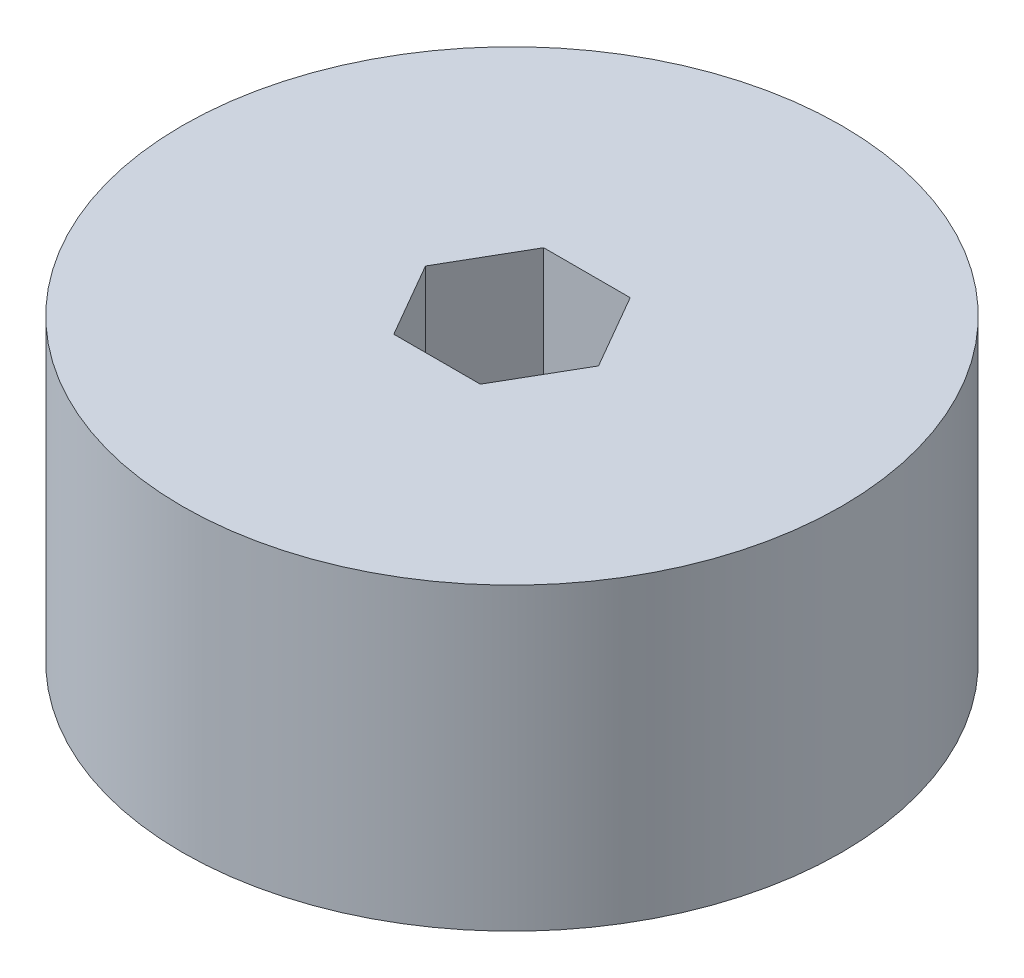
ISO-10303-21;
HEADER;
FILE_DESCRIPTION(('STEP AP214'),'2;1');
FILE_NAME('part.step','',(''),(''),'','','');
FILE_SCHEMA(('AUTOMOTIVE_DESIGN { 1 0 10303 214 1 1 1 1 }'));
ENDSEC;
DATA;
#1=APPLICATION_CONTEXT('core data for automotive mechanical design processes');
#2=APPLICATION_PROTOCOL_DEFINITION('international standard','automotive_design',2000,#1);
#3=PRODUCT_CONTEXT('',#1,'mechanical');
#4=PRODUCT('Part','Part','',(#3));
#5=PRODUCT_RELATED_PRODUCT_CATEGORY('part','',(#4));
#6=PRODUCT_DEFINITION_FORMATION('','',#4);
#7=PRODUCT_DEFINITION_CONTEXT('part definition',#1,'design');
#8=PRODUCT_DEFINITION('design','',#6,#7);
#9=PRODUCT_DEFINITION_SHAPE('','',#8);
#10=(LENGTH_UNIT() NAMED_UNIT(*) SI_UNIT(.MILLI.,.METRE.));
#11=(NAMED_UNIT(*) PLANE_ANGLE_UNIT() SI_UNIT($,.RADIAN.));
#12=(NAMED_UNIT(*) SI_UNIT($,.STERADIAN.) SOLID_ANGLE_UNIT());
#13=UNCERTAINTY_MEASURE_WITH_UNIT(LENGTH_MEASURE(1.E-05),#10,'distance_accuracy_value','');
#14=(GEOMETRIC_REPRESENTATION_CONTEXT(3) GLOBAL_UNCERTAINTY_ASSIGNED_CONTEXT((#13)) GLOBAL_UNIT_ASSIGNED_CONTEXT((#10,
#11,#12)) REPRESENTATION_CONTEXT('',''));
#15=CARTESIAN_POINT('',(0.,0.,0.));
#16=DIRECTION('',(0.,0.,1.));
#17=DIRECTION('',(1.,0.,0.));
#18=AXIS2_PLACEMENT_3D('',#15,#16,#17);
#19=CARTESIAN_POINT('',(0.,25.4,0.));
#20=DIRECTION('',(0.,-1.,0.));
#21=DIRECTION('',(0.,0.,-1.));
#22=AXIS2_PLACEMENT_3D('',#19,#20,#21);
#23=CYLINDRICAL_SURFACE('',#22,27.94);
#24=CARTESIAN_POINT('',(0.,25.4,0.));
#25=DIRECTION('',(0.,1.,0.));
#26=DIRECTION('',(0.,0.,1.));
#27=AXIS2_PLACEMENT_3D('',#24,#25,#26);
#28=CIRCLE('',#27,27.94);
#29=CARTESIAN_POINT('',(0.,25.4,27.94));
#30=VERTEX_POINT('',#29);
#31=EDGE_CURVE('E11',#30,#30,#28,.T.);
#32=ORIENTED_EDGE('',*,*,#31,.F.);
#33=EDGE_LOOP('',(#32));
#34=FACE_BOUND('',#33,.T.);
#35=CARTESIAN_POINT('',(0.,0.,0.));
#36=DIRECTION('',(0.,1.,0.));
#37=DIRECTION('',(0.,0.,1.));
#38=AXIS2_PLACEMENT_3D('',#35,#36,#37);
#39=CIRCLE('',#38,27.94);
#40=CARTESIAN_POINT('',(0.,0.,27.94));
#41=VERTEX_POINT('',#40);
#42=EDGE_CURVE('E46',#41,#41,#39,.T.);
#43=ORIENTED_EDGE('',*,*,#42,.T.);
#44=EDGE_LOOP('',(#43));
#45=FACE_BOUND('',#44,.T.);
#46=ADVANCED_FACE('F43',(#34,#45),#23,.T.);
#47=CARTESIAN_POINT('',(0.,25.4,0.));
#48=DIRECTION('',(0.,1.,0.));
#49=DIRECTION('',(0.,0.,1.));
#50=AXIS2_PLACEMENT_3D('',#47,#48,#49);
#51=PLANE('',#50);
#52=DIRECTION('',(-1.,0.,0.));
#53=VECTOR('',#52,1.);
#54=CARTESIAN_POINT('',(3.66617420935412,25.4,6.35));
#55=LINE('',#54,#53);
#56=CARTESIAN_POINT('',(3.66617420935412,25.4,6.35));
#57=VERTEX_POINT('',#56);
#58=CARTESIAN_POINT('',(-3.66617420935412,25.4,6.35));
#59=VERTEX_POINT('',#58);
#60=EDGE_CURVE('E98',#57,#59,#55,.T.);
#61=ORIENTED_EDGE('',*,*,#60,.T.);
#62=DIRECTION('',(-0.5,0.,-0.866025403784439));
#63=VECTOR('',#62,1.);
#64=CARTESIAN_POINT('',(-3.66617420935412,25.4,6.35));
#65=LINE('',#64,#63);
#66=CARTESIAN_POINT('',(-7.33234841870824,25.4,0.));
#67=VERTEX_POINT('',#66);
#68=EDGE_CURVE('E108',#59,#67,#65,.T.);
#69=ORIENTED_EDGE('',*,*,#68,.T.);
#70=DIRECTION('',(0.5,0.,-0.866025403784439));
#71=VECTOR('',#70,1.);
#72=CARTESIAN_POINT('',(-7.33234841870825,25.4,0.));
#73=LINE('',#72,#71);
#74=CARTESIAN_POINT('',(-3.66617420935412,25.4,-6.35));
#75=VERTEX_POINT('',#74);
#76=EDGE_CURVE('E58',#67,#75,#73,.T.);
#77=ORIENTED_EDGE('',*,*,#76,.T.);
#78=DIRECTION('',(1.,0.,0.));
#79=VECTOR('',#78,1.);
#80=CARTESIAN_POINT('',(-3.66617420935412,25.4,-6.35));
#81=LINE('',#80,#79);
#82=CARTESIAN_POINT('',(3.66617420935413,25.4,-6.35));
#83=VERTEX_POINT('',#82);
#84=EDGE_CURVE('E127',#75,#83,#81,.T.);
#85=ORIENTED_EDGE('',*,*,#84,.T.);
#86=DIRECTION('',(0.5,0.,0.866025403784439));
#87=VECTOR('',#86,1.);
#88=CARTESIAN_POINT('',(3.66617420935413,25.4,-6.35));
#89=LINE('',#88,#87);
#90=CARTESIAN_POINT('',(7.33234841870825,25.4,0.));
#91=VERTEX_POINT('',#90);
#92=EDGE_CURVE('E131',#83,#91,#89,.T.);
#93=ORIENTED_EDGE('',*,*,#92,.T.);
#94=DIRECTION('',(-0.5,0.,0.866025403784439));
#95=VECTOR('',#94,1.);
#96=CARTESIAN_POINT('',(7.33234841870825,25.4,0.));
#97=LINE('',#96,#95);
#98=EDGE_CURVE('E105',#91,#57,#97,.T.);
#99=ORIENTED_EDGE('',*,*,#98,.T.);
#100=EDGE_LOOP('',(#61,#69,#77,#85,#93,#99));
#101=FACE_BOUND('',#100,.T.);
#102=ORIENTED_EDGE('',*,*,#31,.T.);
#103=EDGE_LOOP('',(#102));
#104=FACE_BOUND('',#103,.T.);
#105=ADVANCED_FACE('F113',(#101,#104),#51,.T.);
#106=CARTESIAN_POINT('',(0.,0.,0.));
#107=DIRECTION('',(0.,1.,0.));
#108=DIRECTION('',(0.,0.,1.));
#109=AXIS2_PLACEMENT_3D('',#106,#107,#108);
#110=PLANE('',#109);
#111=DIRECTION('',(-0.5,0.,-0.866025403784439));
#112=VECTOR('',#111,1.);
#113=CARTESIAN_POINT('',(-3.66617420935412,0.,6.35));
#114=LINE('',#113,#112);
#115=CARTESIAN_POINT('',(-3.66617420935412,0.,6.35));
#116=VERTEX_POINT('',#115);
#117=CARTESIAN_POINT('',(-7.33234841870825,0.,0.));
#118=VERTEX_POINT('',#117);
#119=EDGE_CURVE('E138',#116,#118,#114,.T.);
#120=ORIENTED_EDGE('',*,*,#119,.F.);
#121=DIRECTION('',(-1.,0.,0.));
#122=VECTOR('',#121,1.);
#123=CARTESIAN_POINT('',(3.66617420935412,0.,6.35));
#124=LINE('',#123,#122);
#125=CARTESIAN_POINT('',(3.66617420935412,0.,6.35));
#126=VERTEX_POINT('',#125);
#127=EDGE_CURVE('E66',#126,#116,#124,.T.);
#128=ORIENTED_EDGE('',*,*,#127,.F.);
#129=DIRECTION('',(-0.5,0.,0.866025403784439));
#130=VECTOR('',#129,1.);
#131=CARTESIAN_POINT('',(7.33234841870825,0.,0.));
#132=LINE('',#131,#130);
#133=CARTESIAN_POINT('',(7.33234841870825,0.,0.));
#134=VERTEX_POINT('',#133);
#135=EDGE_CURVE('E118',#134,#126,#132,.T.);
#136=ORIENTED_EDGE('',*,*,#135,.F.);
#137=DIRECTION('',(0.5,0.,0.866025403784439));
#138=VECTOR('',#137,1.);
#139=CARTESIAN_POINT('',(3.66617420935413,0.,-6.35));
#140=LINE('',#139,#138);
#141=CARTESIAN_POINT('',(3.66617420935413,0.,-6.35));
#142=VERTEX_POINT('',#141);
#143=EDGE_CURVE('E122',#142,#134,#140,.T.);
#144=ORIENTED_EDGE('',*,*,#143,.F.);
#145=DIRECTION('',(1.,0.,0.));
#146=VECTOR('',#145,1.);
#147=CARTESIAN_POINT('',(-3.66617420935412,0.,-6.35));
#148=LINE('',#147,#146);
#149=CARTESIAN_POINT('',(-3.66617420935412,0.,-6.35));
#150=VERTEX_POINT('',#149);
#151=EDGE_CURVE('E145',#150,#142,#148,.T.);
#152=ORIENTED_EDGE('',*,*,#151,.F.);
#153=DIRECTION('',(0.5,0.,-0.866025403784439));
#154=VECTOR('',#153,1.);
#155=CARTESIAN_POINT('',(-7.33234841870825,0.,0.));
#156=LINE('',#155,#154);
#157=EDGE_CURVE('E141',#118,#150,#156,.T.);
#158=ORIENTED_EDGE('',*,*,#157,.F.);
#159=EDGE_LOOP('',(#120,#128,#136,#144,#152,#158));
#160=FACE_BOUND('',#159,.T.);
#161=ORIENTED_EDGE('',*,*,#42,.F.);
#162=EDGE_LOOP('',(#161));
#163=FACE_BOUND('',#162,.T.);
#164=ADVANCED_FACE('F169',(#160,#163),#110,.F.);
#165=CARTESIAN_POINT('',(3.66617420935412,25.4,6.35));
#166=DIRECTION('',(0.,0.,1.));
#167=DIRECTION('',(1.,0.,0.));
#168=AXIS2_PLACEMENT_3D('',#165,#166,#167);
#169=PLANE('',#168);
#170=ORIENTED_EDGE('',*,*,#127,.T.);
#171=DIRECTION('',(0.,-1.,0.));
#172=VECTOR('',#171,1.);
#173=CARTESIAN_POINT('',(-3.66617420935412,25.4,6.35));
#174=LINE('',#173,#172);
#175=EDGE_CURVE('E94',#59,#116,#174,.T.);
#176=ORIENTED_EDGE('',*,*,#175,.F.);
#177=ORIENTED_EDGE('',*,*,#60,.F.);
#178=DIRECTION('',(0.,-1.,0.));
#179=VECTOR('',#178,1.);
#180=CARTESIAN_POINT('',(3.66617420935412,25.4,6.35));
#181=LINE('',#180,#179);
#182=EDGE_CURVE('E152',#57,#126,#181,.T.);
#183=ORIENTED_EDGE('',*,*,#182,.T.);
#184=EDGE_LOOP('',(#170,#176,#177,#183));
#185=FACE_BOUND('',#184,.T.);
#186=ADVANCED_FACE('F96',(#185),#169,.F.);
#187=CARTESIAN_POINT('',(7.33234841870825,25.4,0.));
#188=DIRECTION('',(0.866025403784439,0.,0.5));
#189=DIRECTION('',(0.5,0.,-0.866025403784439));
#190=AXIS2_PLACEMENT_3D('',#187,#188,#189);
#191=PLANE('',#190);
#192=ORIENTED_EDGE('',*,*,#135,.T.);
#193=ORIENTED_EDGE('',*,*,#182,.F.);
#194=ORIENTED_EDGE('',*,*,#98,.F.);
#195=DIRECTION('',(0.,-1.,0.));
#196=VECTOR('',#195,1.);
#197=CARTESIAN_POINT('',(7.33234841870825,25.4,0.));
#198=LINE('',#197,#196);
#199=EDGE_CURVE('E155',#91,#134,#198,.T.);
#200=ORIENTED_EDGE('',*,*,#199,.T.);
#201=EDGE_LOOP('',(#192,#193,#194,#200));
#202=FACE_BOUND('',#201,.T.);
#203=ADVANCED_FACE('F180',(#202),#191,.F.);
#204=CARTESIAN_POINT('',(3.66617420935413,25.4,-6.35));
#205=DIRECTION('',(0.866025403784439,0.,-0.5));
#206=DIRECTION('',(-0.5,0.,-0.866025403784439));
#207=AXIS2_PLACEMENT_3D('',#204,#205,#206);
#208=PLANE('',#207);
#209=ORIENTED_EDGE('',*,*,#143,.T.);
#210=ORIENTED_EDGE('',*,*,#199,.F.);
#211=ORIENTED_EDGE('',*,*,#92,.F.);
#212=DIRECTION('',(0.,-1.,0.));
#213=VECTOR('',#212,1.);
#214=CARTESIAN_POINT('',(3.66617420935413,25.4,-6.35));
#215=LINE('',#214,#213);
#216=EDGE_CURVE('E158',#83,#142,#215,.T.);
#217=ORIENTED_EDGE('',*,*,#216,.T.);
#218=EDGE_LOOP('',(#209,#210,#211,#217));
#219=FACE_BOUND('',#218,.T.);
#220=ADVANCED_FACE('F178',(#219),#208,.F.);
#221=CARTESIAN_POINT('',(-3.66617420935412,25.4,-6.35));
#222=DIRECTION('',(0.,0.,-1.));
#223=DIRECTION('',(-1.,0.,0.));
#224=AXIS2_PLACEMENT_3D('',#221,#222,#223);
#225=PLANE('',#224);
#226=ORIENTED_EDGE('',*,*,#151,.T.);
#227=ORIENTED_EDGE('',*,*,#216,.F.);
#228=ORIENTED_EDGE('',*,*,#84,.F.);
#229=DIRECTION('',(0.,-1.,0.));
#230=VECTOR('',#229,1.);
#231=CARTESIAN_POINT('',(-3.66617420935412,25.4,-6.35));
#232=LINE('',#231,#230);
#233=EDGE_CURVE('E161',#75,#150,#232,.T.);
#234=ORIENTED_EDGE('',*,*,#233,.T.);
#235=EDGE_LOOP('',(#226,#227,#228,#234));
#236=FACE_BOUND('',#235,.T.);
#237=ADVANCED_FACE('F174',(#236),#225,.F.);
#238=CARTESIAN_POINT('',(-7.33234841870825,25.4,0.));
#239=DIRECTION('',(-0.866025403784439,0.,-0.5));
#240=DIRECTION('',(-0.5,0.,0.866025403784439));
#241=AXIS2_PLACEMENT_3D('',#238,#239,#240);
#242=PLANE('',#241);
#243=ORIENTED_EDGE('',*,*,#157,.T.);
#244=ORIENTED_EDGE('',*,*,#233,.F.);
#245=ORIENTED_EDGE('',*,*,#76,.F.);
#246=DIRECTION('',(0.,-1.,0.));
#247=VECTOR('',#246,1.);
#248=CARTESIAN_POINT('',(-7.33234841870825,25.4,0.));
#249=LINE('',#248,#247);
#250=EDGE_CURVE('E104',#67,#118,#249,.T.);
#251=ORIENTED_EDGE('',*,*,#250,.T.);
#252=EDGE_LOOP('',(#243,#244,#245,#251));
#253=FACE_BOUND('',#252,.T.);
#254=ADVANCED_FACE('F165',(#253),#242,.F.);
#255=CARTESIAN_POINT('',(-3.66617420935412,25.4,6.35));
#256=DIRECTION('',(-0.866025403784439,0.,0.5));
#257=DIRECTION('',(0.5,0.,0.866025403784439));
#258=AXIS2_PLACEMENT_3D('',#255,#256,#257);
#259=PLANE('',#258);
#260=ORIENTED_EDGE('',*,*,#119,.T.);
#261=ORIENTED_EDGE('',*,*,#250,.F.);
#262=ORIENTED_EDGE('',*,*,#68,.F.);
#263=ORIENTED_EDGE('',*,*,#175,.T.);
#264=EDGE_LOOP('',(#260,#261,#262,#263));
#265=FACE_BOUND('',#264,.T.);
#266=ADVANCED_FACE('F109',(#265),#259,.F.);
#267=CLOSED_SHELL('',(#46,#105,#164,#186,#203,#220,#237,#254,#266));
#268=MANIFOLD_SOLID_BREP('B2',#267);
#269=ADVANCED_BREP_SHAPE_REPRESENTATION('',(#18,#268),#14);
#270=SHAPE_DEFINITION_REPRESENTATION(#9,#269);
ENDSEC;
END-ISO-10303-21;
